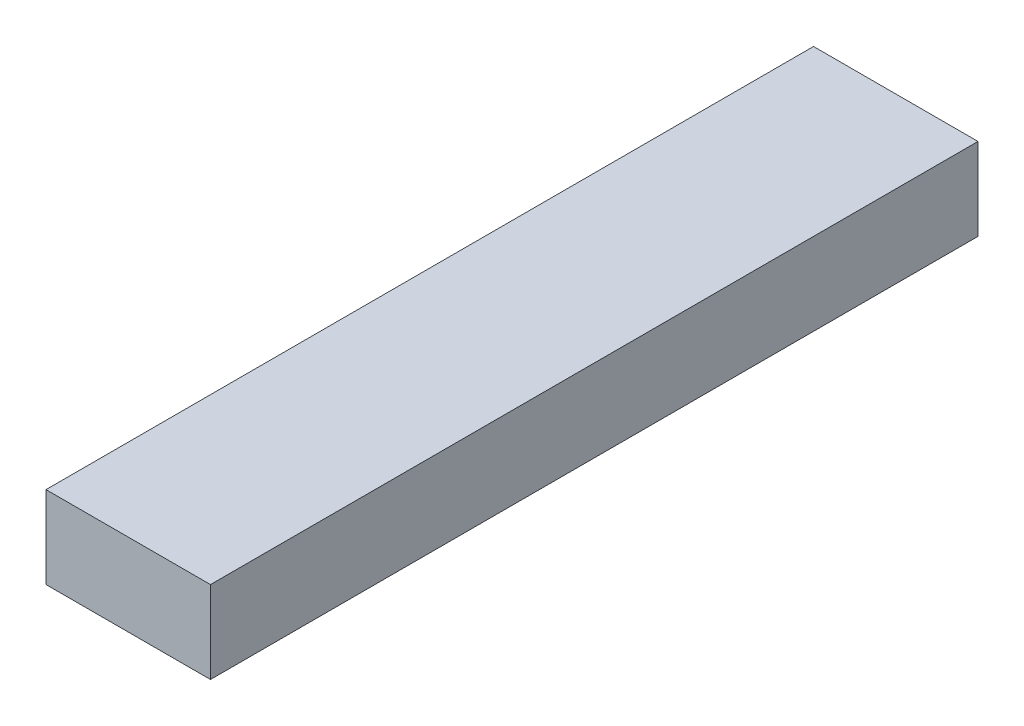
ISO-10303-21;
HEADER;
FILE_DESCRIPTION(('STEP AP214'),'2;1');
FILE_NAME('part.step','',(''),(''),'','','');
FILE_SCHEMA(('AUTOMOTIVE_DESIGN { 1 0 10303 214 1 1 1 1 }'));
ENDSEC;
DATA;
#1=APPLICATION_CONTEXT('core data for automotive mechanical design processes');
#2=APPLICATION_PROTOCOL_DEFINITION('international standard','automotive_design',2000,#1);
#3=PRODUCT_CONTEXT('',#1,'mechanical');
#4=PRODUCT('Part','Part','',(#3));
#5=PRODUCT_RELATED_PRODUCT_CATEGORY('part','',(#4));
#6=PRODUCT_DEFINITION_FORMATION('','',#4);
#7=PRODUCT_DEFINITION_CONTEXT('part definition',#1,'design');
#8=PRODUCT_DEFINITION('design','',#6,#7);
#9=PRODUCT_DEFINITION_SHAPE('','',#8);
#10=(LENGTH_UNIT() NAMED_UNIT(*) SI_UNIT(.MILLI.,.METRE.));
#11=(NAMED_UNIT(*) PLANE_ANGLE_UNIT() SI_UNIT($,.RADIAN.));
#12=(NAMED_UNIT(*) SI_UNIT($,.STERADIAN.) SOLID_ANGLE_UNIT());
#13=UNCERTAINTY_MEASURE_WITH_UNIT(LENGTH_MEASURE(1.E-05),#10,'distance_accuracy_value','');
#14=(GEOMETRIC_REPRESENTATION_CONTEXT(3) GLOBAL_UNCERTAINTY_ASSIGNED_CONTEXT((#13)) GLOBAL_UNIT_ASSIGNED_CONTEXT((#10,
#11,#12)) REPRESENTATION_CONTEXT('',''));
#15=CARTESIAN_POINT('',(0.,0.,0.));
#16=DIRECTION('',(0.,0.,1.));
#17=DIRECTION('',(1.,0.,0.));
#18=AXIS2_PLACEMENT_3D('',#15,#16,#17);
#19=CARTESIAN_POINT('',(0.,0.,-44.45));
#20=DIRECTION('',(-1.,0.,0.));
#21=DIRECTION('',(0.,0.,1.));
#22=AXIS2_PLACEMENT_3D('',#19,#20,#21);
#23=PLANE('',#22);
#24=DIRECTION('',(0.,-1.,0.));
#25=VECTOR('',#24,1.);
#26=CARTESIAN_POINT('',(0.,0.,0.));
#27=LINE('',#26,#25);
#28=CARTESIAN_POINT('',(0.,4.7625,0.));
#29=VERTEX_POINT('',#28);
#30=CARTESIAN_POINT('',(0.,0.,0.));
#31=VERTEX_POINT('',#30);
#32=EDGE_CURVE('E109',#29,#31,#27,.T.);
#33=ORIENTED_EDGE('',*,*,#32,.F.);
#34=DIRECTION('',(0.,0.,1.));
#35=VECTOR('',#34,1.);
#36=CARTESIAN_POINT('',(0.,4.7625,-44.45));
#37=LINE('',#36,#35);
#38=CARTESIAN_POINT('',(0.,4.7625,-44.45));
#39=VERTEX_POINT('',#38);
#40=EDGE_CURVE('E11',#39,#29,#37,.T.);
#41=ORIENTED_EDGE('',*,*,#40,.F.);
#42=DIRECTION('',(0.,-1.,0.));
#43=VECTOR('',#42,1.);
#44=CARTESIAN_POINT('',(0.,0.,-44.45));
#45=LINE('',#44,#43);
#46=CARTESIAN_POINT('',(0.,0.,-44.45));
#47=VERTEX_POINT('',#46);
#48=EDGE_CURVE('E101',#39,#47,#45,.T.);
#49=ORIENTED_EDGE('',*,*,#48,.T.);
#50=DIRECTION('',(0.,0.,1.));
#51=VECTOR('',#50,1.);
#52=CARTESIAN_POINT('',(0.,0.,-44.45));
#53=LINE('',#52,#51);
#54=EDGE_CURVE('E42',#47,#31,#53,.T.);
#55=ORIENTED_EDGE('',*,*,#54,.T.);
#56=EDGE_LOOP('',(#33,#41,#49,#55));
#57=FACE_BOUND('',#56,.T.);
#58=ADVANCED_FACE('F39',(#57),#23,.T.);
#59=CARTESIAN_POINT('',(0.,4.7625,-44.45));
#60=DIRECTION('',(0.,1.,0.));
#61=DIRECTION('',(0.,0.,1.));
#62=AXIS2_PLACEMENT_3D('',#59,#60,#61);
#63=PLANE('',#62);
#64=DIRECTION('',(-1.,0.,0.));
#65=VECTOR('',#64,1.);
#66=CARTESIAN_POINT('',(0.,4.7625,0.));
#67=LINE('',#66,#65);
#68=CARTESIAN_POINT('',(9.525,4.7625,0.));
#69=VERTEX_POINT('',#68);
#70=EDGE_CURVE('E104',#69,#29,#67,.T.);
#71=ORIENTED_EDGE('',*,*,#70,.F.);
#72=DIRECTION('',(0.,0.,1.));
#73=VECTOR('',#72,1.);
#74=CARTESIAN_POINT('',(9.525,4.7625,-44.45));
#75=LINE('',#74,#73);
#76=CARTESIAN_POINT('',(9.525,4.7625,-44.45));
#77=VERTEX_POINT('',#76);
#78=EDGE_CURVE('E49',#77,#69,#75,.T.);
#79=ORIENTED_EDGE('',*,*,#78,.F.);
#80=DIRECTION('',(-1.,0.,0.));
#81=VECTOR('',#80,1.);
#82=CARTESIAN_POINT('',(0.,4.7625,-44.45));
#83=LINE('',#82,#81);
#84=EDGE_CURVE('E96',#77,#39,#83,.T.);
#85=ORIENTED_EDGE('',*,*,#84,.T.);
#86=ORIENTED_EDGE('',*,*,#40,.T.);
#87=EDGE_LOOP('',(#71,#79,#85,#86));
#88=FACE_BOUND('',#87,.T.);
#89=ADVANCED_FACE('F125',(#88),#63,.T.);
#90=CARTESIAN_POINT('',(9.525,0.,-44.45));
#91=DIRECTION('',(1.,0.,0.));
#92=DIRECTION('',(0.,0.,-1.));
#93=AXIS2_PLACEMENT_3D('',#90,#91,#92);
#94=PLANE('',#93);
#95=DIRECTION('',(0.,1.,0.));
#96=VECTOR('',#95,1.);
#97=CARTESIAN_POINT('',(9.525,0.,0.));
#98=LINE('',#97,#96);
#99=CARTESIAN_POINT('',(9.525,0.,0.));
#100=VERTEX_POINT('',#99);
#101=EDGE_CURVE('E90',#100,#69,#98,.T.);
#102=ORIENTED_EDGE('',*,*,#101,.F.);
#103=DIRECTION('',(0.,0.,1.));
#104=VECTOR('',#103,1.);
#105=CARTESIAN_POINT('',(9.525,0.,-44.45));
#106=LINE('',#105,#104);
#107=CARTESIAN_POINT('',(9.525,0.,-44.45));
#108=VERTEX_POINT('',#107);
#109=EDGE_CURVE('E85',#108,#100,#106,.T.);
#110=ORIENTED_EDGE('',*,*,#109,.F.);
#111=DIRECTION('',(0.,1.,0.));
#112=VECTOR('',#111,1.);
#113=CARTESIAN_POINT('',(9.525,0.,-44.45));
#114=LINE('',#113,#112);
#115=EDGE_CURVE('E88',#108,#77,#114,.T.);
#116=ORIENTED_EDGE('',*,*,#115,.T.);
#117=ORIENTED_EDGE('',*,*,#78,.T.);
#118=EDGE_LOOP('',(#102,#110,#116,#117));
#119=FACE_BOUND('',#118,.T.);
#120=ADVANCED_FACE('F87',(#119),#94,.T.);
#121=CARTESIAN_POINT('',(0.,0.,-44.45));
#122=DIRECTION('',(0.,-1.,0.));
#123=DIRECTION('',(0.,0.,-1.));
#124=AXIS2_PLACEMENT_3D('',#121,#122,#123);
#125=PLANE('',#124);
#126=DIRECTION('',(1.,0.,0.));
#127=VECTOR('',#126,1.);
#128=CARTESIAN_POINT('',(0.,0.,0.));
#129=LINE('',#128,#127);
#130=EDGE_CURVE('E113',#31,#100,#129,.T.);
#131=ORIENTED_EDGE('',*,*,#130,.F.);
#132=ORIENTED_EDGE('',*,*,#54,.F.);
#133=DIRECTION('',(1.,0.,0.));
#134=VECTOR('',#133,1.);
#135=CARTESIAN_POINT('',(0.,0.,-44.45));
#136=LINE('',#135,#134);
#137=EDGE_CURVE('E95',#47,#108,#136,.T.);
#138=ORIENTED_EDGE('',*,*,#137,.T.);
#139=ORIENTED_EDGE('',*,*,#109,.T.);
#140=EDGE_LOOP('',(#131,#132,#138,#139));
#141=FACE_BOUND('',#140,.T.);
#142=ADVANCED_FACE('F99',(#141),#125,.T.);
#143=CARTESIAN_POINT('',(0.,0.,-44.45));
#144=DIRECTION('',(0.,0.,-1.));
#145=DIRECTION('',(-1.,0.,0.));
#146=AXIS2_PLACEMENT_3D('',#143,#144,#145);
#147=PLANE('',#146);
#148=ORIENTED_EDGE('',*,*,#48,.F.);
#149=ORIENTED_EDGE('',*,*,#84,.F.);
#150=ORIENTED_EDGE('',*,*,#115,.F.);
#151=ORIENTED_EDGE('',*,*,#137,.F.);
#152=EDGE_LOOP('',(#148,#149,#150,#151));
#153=FACE_BOUND('',#152,.T.);
#154=ADVANCED_FACE('F94',(#153),#147,.T.);
#155=CARTESIAN_POINT('',(0.,0.,0.));
#156=DIRECTION('',(0.,0.,-1.));
#157=DIRECTION('',(-1.,0.,0.));
#158=AXIS2_PLACEMENT_3D('',#155,#156,#157);
#159=PLANE('',#158);
#160=ORIENTED_EDGE('',*,*,#32,.T.);
#161=ORIENTED_EDGE('',*,*,#130,.T.);
#162=ORIENTED_EDGE('',*,*,#101,.T.);
#163=ORIENTED_EDGE('',*,*,#70,.T.);
#164=EDGE_LOOP('',(#160,#161,#162,#163));
#165=FACE_BOUND('',#164,.T.);
#166=ADVANCED_FACE('F124',(#165),#159,.F.);
#167=CLOSED_SHELL('',(#58,#89,#120,#142,#154,#166));
#168=MANIFOLD_SOLID_BREP('B2',#167);
#169=ADVANCED_BREP_SHAPE_REPRESENTATION('',(#18,#168),#14);
#170=SHAPE_DEFINITION_REPRESENTATION(#9,#169);
ENDSEC;
END-ISO-10303-21;
